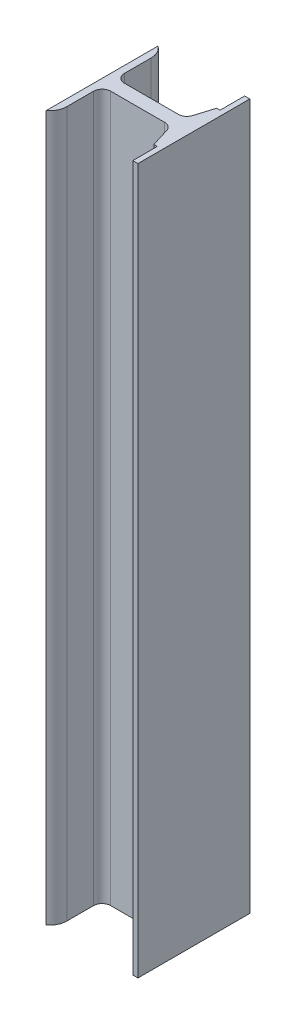
ISO-10303-21;
HEADER;
FILE_DESCRIPTION(('STEP AP214'),'2;1');
FILE_NAME('part.step','',(''),(''),'','','');
FILE_SCHEMA(('AUTOMOTIVE_DESIGN { 1 0 10303 214 1 1 1 1 }'));
ENDSEC;
DATA;
#1=APPLICATION_CONTEXT('core data for automotive mechanical design processes');
#2=APPLICATION_PROTOCOL_DEFINITION('international standard','automotive_design',2000,#1);
#3=PRODUCT_CONTEXT('',#1,'mechanical');
#4=PRODUCT('Part','Part','',(#3));
#5=PRODUCT_RELATED_PRODUCT_CATEGORY('part','',(#4));
#6=PRODUCT_DEFINITION_FORMATION('','',#4);
#7=PRODUCT_DEFINITION_CONTEXT('part definition',#1,'design');
#8=PRODUCT_DEFINITION('design','',#6,#7);
#9=PRODUCT_DEFINITION_SHAPE('','',#8);
#10=(LENGTH_UNIT() NAMED_UNIT(*) SI_UNIT(.MILLI.,.METRE.));
#11=(NAMED_UNIT(*) PLANE_ANGLE_UNIT() SI_UNIT($,.RADIAN.));
#12=(NAMED_UNIT(*) SI_UNIT($,.STERADIAN.) SOLID_ANGLE_UNIT());
#13=UNCERTAINTY_MEASURE_WITH_UNIT(LENGTH_MEASURE(1.E-05),#10,'distance_accuracy_value','');
#14=(GEOMETRIC_REPRESENTATION_CONTEXT(3) GLOBAL_UNCERTAINTY_ASSIGNED_CONTEXT((#13)) GLOBAL_UNIT_ASSIGNED_CONTEXT((#10,
#11,#12)) REPRESENTATION_CONTEXT('',''));
#15=CARTESIAN_POINT('',(0.,0.,0.));
#16=DIRECTION('',(0.,0.,1.));
#17=DIRECTION('',(1.,0.,0.));
#18=AXIS2_PLACEMENT_3D('',#15,#16,#17);
#19=CARTESIAN_POINT('',(-117.923660484395,410.,-93.4117668867217));
#20=DIRECTION('',(1.,0.,0.));
#21=DIRECTION('',(0.,0.,-1.));
#22=AXIS2_PLACEMENT_3D('',#19,#20,#21);
#23=PLANE('',#22);
#24=DIRECTION('',(0.,0.,1.));
#25=VECTOR('',#24,1.);
#26=CARTESIAN_POINT('',(-117.923660484395,0.,-93.4117668867217));
#27=LINE('',#26,#25);
#28=CARTESIAN_POINT('',(-117.923660484395,0.,-93.4117668867217));
#29=VERTEX_POINT('',#28);
#30=CARTESIAN_POINT('',(-117.923660484395,0.,-28.4117668867217));
#31=VERTEX_POINT('',#30);
#32=EDGE_CURVE('E341',#29,#31,#27,.T.);
#33=ORIENTED_EDGE('',*,*,#32,.T.);
#34=DIRECTION('',(0.,-1.,0.));
#35=VECTOR('',#34,1.);
#36=CARTESIAN_POINT('',(-117.923660484395,410.,-28.4117668867217));
#37=LINE('',#36,#35);
#38=CARTESIAN_POINT('',(-117.923660484395,410.,-28.4117668867217));
#39=VERTEX_POINT('',#38);
#40=EDGE_CURVE('E190',#39,#31,#37,.T.);
#41=ORIENTED_EDGE('',*,*,#40,.F.);
#42=DIRECTION('',(0.,0.,1.));
#43=VECTOR('',#42,1.);
#44=CARTESIAN_POINT('',(-117.923660484395,410.,-93.4117668867217));
#45=LINE('',#44,#43);
#46=CARTESIAN_POINT('',(-117.923660484395,410.,-93.4117668867217));
#47=VERTEX_POINT('',#46);
#48=EDGE_CURVE('E174',#47,#39,#45,.T.);
#49=ORIENTED_EDGE('',*,*,#48,.F.);
#50=DIRECTION('',(0.,-1.,0.));
#51=VECTOR('',#50,1.);
#52=CARTESIAN_POINT('',(-117.923660484395,410.,-93.4117668867217));
#53=LINE('',#52,#51);
#54=EDGE_CURVE('E188',#47,#29,#53,.T.);
#55=ORIENTED_EDGE('',*,*,#54,.T.);
#56=EDGE_LOOP('',(#33,#41,#49,#55));
#57=FACE_BOUND('',#56,.T.);
#58=ADVANCED_FACE('F34',(#57),#23,.F.);
#59=CARTESIAN_POINT('',(-113.923660484395,410.,-28.4117668867217));
#60=DIRECTION('',(-1.,0.,0.));
#61=DIRECTION('',(0.,0.,1.));
#62=AXIS2_PLACEMENT_3D('',#59,#60,#61);
#63=PLANE('',#62);
#64=DIRECTION('',(0.,0.,-1.));
#65=VECTOR('',#64,1.);
#66=CARTESIAN_POINT('',(-113.923660484395,0.,-28.4117668867217));
#67=LINE('',#66,#65);
#68=CARTESIAN_POINT('',(-113.923660484395,0.,-36.4117668867217));
#69=VERTEX_POINT('',#68);
#70=CARTESIAN_POINT('',(-113.923660484395,0.,-51.9117668867217));
#71=VERTEX_POINT('',#70);
#72=EDGE_CURVE('E343',#69,#71,#67,.T.);
#73=ORIENTED_EDGE('',*,*,#72,.T.);
#74=DIRECTION('',(0.,-1.,0.));
#75=VECTOR('',#74,1.);
#76=CARTESIAN_POINT('',(-113.923660484395,410.,-51.9117668867217));
#77=LINE('',#76,#75);
#78=CARTESIAN_POINT('',(-113.923660484395,410.,-51.9117668867217));
#79=VERTEX_POINT('',#78);
#80=EDGE_CURVE('E55',#71,#79,#77,.F.);
#81=ORIENTED_EDGE('',*,*,#80,.T.);
#82=DIRECTION('',(0.,0.,-1.));
#83=VECTOR('',#82,1.);
#84=CARTESIAN_POINT('',(-113.923660484395,410.,-28.4117668867217));
#85=LINE('',#84,#83);
#86=CARTESIAN_POINT('',(-113.923660484395,410.,-36.4117668867217));
#87=VERTEX_POINT('',#86);
#88=EDGE_CURVE('E192',#87,#79,#85,.T.);
#89=ORIENTED_EDGE('',*,*,#88,.F.);
#90=DIRECTION('',(0.,-1.,0.));
#91=VECTOR('',#90,1.);
#92=CARTESIAN_POINT('',(-113.923660484395,410.,-36.4117668867217));
#93=LINE('',#92,#91);
#94=EDGE_CURVE('E182',#87,#69,#93,.T.);
#95=ORIENTED_EDGE('',*,*,#94,.T.);
#96=EDGE_LOOP('',(#73,#81,#89,#95));
#97=FACE_BOUND('',#96,.T.);
#98=ADVANCED_FACE('F400',(#97),#63,.F.);
#99=CARTESIAN_POINT('',(-73.9236604843951,410.,-56.9117668867217));
#100=DIRECTION('',(0.,0.,-1.));
#101=DIRECTION('',(-1.,0.,0.));
#102=AXIS2_PLACEMENT_3D('',#99,#100,#101);
#103=PLANE('',#102);
#104=DIRECTION('',(1.,0.,0.));
#105=VECTOR('',#104,1.);
#106=CARTESIAN_POINT('',(-73.9236604843951,0.,-56.9117668867217));
#107=LINE('',#106,#105);
#108=CARTESIAN_POINT('',(-108.923660484395,0.,-56.9117668867217));
#109=VERTEX_POINT('',#108);
#110=CARTESIAN_POINT('',(-77.6298527092741,0.,-56.9117668867217));
#111=VERTEX_POINT('',#110);
#112=EDGE_CURVE('E307',#109,#111,#107,.T.);
#113=ORIENTED_EDGE('',*,*,#112,.T.);
#114=DIRECTION('',(0.,-1.,0.));
#115=VECTOR('',#114,1.);
#116=CARTESIAN_POINT('',(-77.6298527092741,410.,-56.9117668867217));
#117=LINE('',#116,#115);
#118=CARTESIAN_POINT('',(-77.6298527092741,410.,-56.9117668867217));
#119=VERTEX_POINT('',#118);
#120=EDGE_CURVE('E225',#111,#119,#117,.F.);
#121=ORIENTED_EDGE('',*,*,#120,.T.);
#122=DIRECTION('',(1.,0.,0.));
#123=VECTOR('',#122,1.);
#124=CARTESIAN_POINT('',(-73.9236604843951,410.,-56.9117668867217));
#125=LINE('',#124,#123);
#126=CARTESIAN_POINT('',(-108.923660484395,410.,-56.9117668867217));
#127=VERTEX_POINT('',#126);
#128=EDGE_CURVE('E356',#127,#119,#125,.T.);
#129=ORIENTED_EDGE('',*,*,#128,.F.);
#130=DIRECTION('',(0.,-1.,0.));
#131=VECTOR('',#130,1.);
#132=CARTESIAN_POINT('',(-108.923660484395,0.,-56.9117668867217));
#133=LINE('',#132,#131);
#134=EDGE_CURVE('E222',#127,#109,#133,.T.);
#135=ORIENTED_EDGE('',*,*,#134,.T.);
#136=EDGE_LOOP('',(#113,#121,#129,#135));
#137=FACE_BOUND('',#136,.T.);
#138=ADVANCED_FACE('F347',(#137),#103,.F.);
#139=CARTESIAN_POINT('',(-69.5926929103981,410.,-42.6617668867217));
#140=DIRECTION('',(0.956785817481346,0.,-0.29079356847522));
#141=DIRECTION('',(-0.29079356847522,0.,-0.956785817481346));
#142=AXIS2_PLACEMENT_3D('',#139,#140,#141);
#143=PLANE('',#142);
#144=DIRECTION('',(0.29079356847522,0.,0.956785817481346));
#145=VECTOR('',#144,1.);
#146=CARTESIAN_POINT('',(-69.5926929103981,410.,-42.6617668867217));
#147=LINE('',#146,#145);
#148=CARTESIAN_POINT('',(-72.8459236218674,410.,-53.3657347290978));
#149=VERTEX_POINT('',#148);
#150=CARTESIAN_POINT('',(-69.5926929103981,410.,-42.6617668867217));
#151=VERTEX_POINT('',#150);
#152=EDGE_CURVE('E355',#149,#151,#147,.T.);
#153=ORIENTED_EDGE('',*,*,#152,.F.);
#154=DIRECTION('',(0.,-1.,0.));
#155=VECTOR('',#154,1.);
#156=CARTESIAN_POINT('',(-72.8459236218674,1.11022302462516E-13,-53.3657347290978));
#157=LINE('',#156,#155);
#158=CARTESIAN_POINT('',(-72.8459236218674,0.,-53.3657347290978));
#159=VERTEX_POINT('',#158);
#160=EDGE_CURVE('E219',#149,#159,#157,.T.);
#161=ORIENTED_EDGE('',*,*,#160,.T.);
#162=DIRECTION('',(0.29079356847522,0.,0.956785817481346));
#163=VECTOR('',#162,1.);
#164=CARTESIAN_POINT('',(-69.5926929103981,0.,-42.6617668867217));
#165=LINE('',#164,#163);
#166=CARTESIAN_POINT('',(-69.5926929103981,0.,-42.6617668867217));
#167=VERTEX_POINT('',#166);
#168=EDGE_CURVE('E301',#159,#167,#165,.T.);
#169=ORIENTED_EDGE('',*,*,#168,.T.);
#170=DIRECTION('',(0.,-1.,0.));
#171=VECTOR('',#170,1.);
#172=CARTESIAN_POINT('',(-69.5926929103981,410.,-42.6617668867217));
#173=LINE('',#172,#171);
#174=EDGE_CURVE('E202',#151,#167,#173,.T.);
#175=ORIENTED_EDGE('',*,*,#174,.F.);
#176=EDGE_LOOP('',(#153,#161,#169,#175));
#177=FACE_BOUND('',#176,.T.);
#178=ADVANCED_FACE('F357',(#177),#143,.F.);
#179=CARTESIAN_POINT('',(-67.5926929103981,410.,-42.6617668867217));
#180=DIRECTION('',(0.,0.,-1.));
#181=DIRECTION('',(-1.,0.,0.));
#182=AXIS2_PLACEMENT_3D('',#179,#180,#181);
#183=PLANE('',#182);
#184=DIRECTION('',(1.,0.,0.));
#185=VECTOR('',#184,1.);
#186=CARTESIAN_POINT('',(-67.5926929103981,0.,-42.6617668867217));
#187=LINE('',#186,#185);
#188=CARTESIAN_POINT('',(-67.5926929103981,0.,-42.6617668867217));
#189=VERTEX_POINT('',#188);
#190=EDGE_CURVE('E295',#167,#189,#187,.T.);
#191=ORIENTED_EDGE('',*,*,#190,.T.);
#192=DIRECTION('',(0.,-1.,0.));
#193=VECTOR('',#192,1.);
#194=CARTESIAN_POINT('',(-67.5926929103981,410.,-42.6617668867217));
#195=LINE('',#194,#193);
#196=CARTESIAN_POINT('',(-67.5926929103981,410.,-42.6617668867217));
#197=VERTEX_POINT('',#196);
#198=EDGE_CURVE('E286',#197,#189,#195,.T.);
#199=ORIENTED_EDGE('',*,*,#198,.F.);
#200=DIRECTION('',(1.,0.,0.));
#201=VECTOR('',#200,1.);
#202=CARTESIAN_POINT('',(-67.5926929103981,410.,-42.6617668867217));
#203=LINE('',#202,#201);
#204=EDGE_CURVE('E296',#151,#197,#203,.T.);
#205=ORIENTED_EDGE('',*,*,#204,.F.);
#206=ORIENTED_EDGE('',*,*,#174,.T.);
#207=EDGE_LOOP('',(#191,#199,#205,#206));
#208=FACE_BOUND('',#207,.T.);
#209=ADVANCED_FACE('F293',(#208),#183,.F.);
#210=CARTESIAN_POINT('',(-67.5926929103981,410.,-28.4117668867217));
#211=DIRECTION('',(1.,0.,0.));
#212=DIRECTION('',(0.,0.,-1.));
#213=AXIS2_PLACEMENT_3D('',#210,#211,#212);
#214=PLANE('',#213);
#215=DIRECTION('',(0.,0.,1.));
#216=VECTOR('',#215,1.);
#217=CARTESIAN_POINT('',(-67.5926929103981,0.,-28.4117668867217));
#218=LINE('',#217,#216);
#219=CARTESIAN_POINT('',(-67.5926929103981,0.,-28.4117668867217));
#220=VERTEX_POINT('',#219);
#221=EDGE_CURVE('E303',#189,#220,#218,.T.);
#222=ORIENTED_EDGE('',*,*,#221,.T.);
#223=DIRECTION('',(0.,-1.,0.));
#224=VECTOR('',#223,1.);
#225=CARTESIAN_POINT('',(-67.5926929103981,410.,-28.4117668867217));
#226=LINE('',#225,#224);
#227=CARTESIAN_POINT('',(-67.5926929103981,410.,-28.4117668867217));
#228=VERTEX_POINT('',#227);
#229=EDGE_CURVE('E283',#228,#220,#226,.T.);
#230=ORIENTED_EDGE('',*,*,#229,.F.);
#231=DIRECTION('',(0.,0.,1.));
#232=VECTOR('',#231,1.);
#233=CARTESIAN_POINT('',(-67.5926929103981,410.,-28.4117668867217));
#234=LINE('',#233,#232);
#235=EDGE_CURVE('E359',#197,#228,#234,.T.);
#236=ORIENTED_EDGE('',*,*,#235,.F.);
#237=ORIENTED_EDGE('',*,*,#198,.T.);
#238=EDGE_LOOP('',(#222,#230,#236,#237));
#239=FACE_BOUND('',#238,.T.);
#240=ADVANCED_FACE('F390',(#239),#214,.F.);
#241=CARTESIAN_POINT('',(-64.5926929103981,410.,-28.4117668867217));
#242=DIRECTION('',(0.,0.,-1.));
#243=DIRECTION('',(-1.,0.,0.));
#244=AXIS2_PLACEMENT_3D('',#241,#242,#243);
#245=PLANE('',#244);
#246=DIRECTION('',(1.,0.,0.));
#247=VECTOR('',#246,1.);
#248=CARTESIAN_POINT('',(-64.5926929103981,0.,-28.4117668867217));
#249=LINE('',#248,#247);
#250=CARTESIAN_POINT('',(-64.5926929103981,0.,-28.4117668867217));
#251=VERTEX_POINT('',#250);
#252=EDGE_CURVE('E305',#220,#251,#249,.T.);
#253=ORIENTED_EDGE('',*,*,#252,.T.);
#254=DIRECTION('',(0.,-1.,0.));
#255=VECTOR('',#254,1.);
#256=CARTESIAN_POINT('',(-64.5926929103981,410.,-28.4117668867217));
#257=LINE('',#256,#255);
#258=CARTESIAN_POINT('',(-64.5926929103981,410.,-28.4117668867217));
#259=VERTEX_POINT('',#258);
#260=EDGE_CURVE('E280',#259,#251,#257,.T.);
#261=ORIENTED_EDGE('',*,*,#260,.F.);
#262=DIRECTION('',(1.,0.,0.));
#263=VECTOR('',#262,1.);
#264=CARTESIAN_POINT('',(-64.5926929103981,410.,-28.4117668867217));
#265=LINE('',#264,#263);
#266=EDGE_CURVE('E365',#228,#259,#265,.T.);
#267=ORIENTED_EDGE('',*,*,#266,.F.);
#268=ORIENTED_EDGE('',*,*,#229,.T.);
#269=EDGE_LOOP('',(#253,#261,#267,#268));
#270=FACE_BOUND('',#269,.T.);
#271=ADVANCED_FACE('F386',(#270),#245,.F.);
#272=CARTESIAN_POINT('',(-64.5926929103981,410.,-93.4117668867217));
#273=DIRECTION('',(-1.,0.,0.));
#274=DIRECTION('',(0.,0.,1.));
#275=AXIS2_PLACEMENT_3D('',#272,#273,#274);
#276=PLANE('',#275);
#277=DIRECTION('',(0.,0.,-1.));
#278=VECTOR('',#277,1.);
#279=CARTESIAN_POINT('',(-64.5926929103981,0.,-93.4117668867217));
#280=LINE('',#279,#278);
#281=CARTESIAN_POINT('',(-64.5926929103981,0.,-93.4117668867217));
#282=VERTEX_POINT('',#281);
#283=EDGE_CURVE('E312',#251,#282,#280,.T.);
#284=ORIENTED_EDGE('',*,*,#283,.T.);
#285=DIRECTION('',(0.,-1.,0.));
#286=VECTOR('',#285,1.);
#287=CARTESIAN_POINT('',(-64.5926929103981,410.,-93.4117668867217));
#288=LINE('',#287,#286);
#289=CARTESIAN_POINT('',(-64.5926929103981,410.,-93.4117668867217));
#290=VERTEX_POINT('',#289);
#291=EDGE_CURVE('E277',#290,#282,#288,.T.);
#292=ORIENTED_EDGE('',*,*,#291,.F.);
#293=DIRECTION('',(0.,0.,-1.));
#294=VECTOR('',#293,1.);
#295=CARTESIAN_POINT('',(-64.5926929103981,410.,-93.4117668867217));
#296=LINE('',#295,#294);
#297=EDGE_CURVE('E367',#259,#290,#296,.T.);
#298=ORIENTED_EDGE('',*,*,#297,.F.);
#299=ORIENTED_EDGE('',*,*,#260,.T.);
#300=EDGE_LOOP('',(#284,#292,#298,#299));
#301=FACE_BOUND('',#300,.T.);
#302=ADVANCED_FACE('F382',(#301),#276,.F.);
#303=CARTESIAN_POINT('',(-67.5926929103981,410.,-93.4117668867217));
#304=DIRECTION('',(0.,0.,1.));
#305=DIRECTION('',(1.,0.,0.));
#306=AXIS2_PLACEMENT_3D('',#303,#304,#305);
#307=PLANE('',#306);
#308=DIRECTION('',(-1.,0.,0.));
#309=VECTOR('',#308,1.);
#310=CARTESIAN_POINT('',(-67.5926929103981,0.,-93.4117668867217));
#311=LINE('',#310,#309);
#312=CARTESIAN_POINT('',(-67.5926929103981,0.,-93.4117668867217));
#313=VERTEX_POINT('',#312);
#314=EDGE_CURVE('E314',#282,#313,#311,.T.);
#315=ORIENTED_EDGE('',*,*,#314,.T.);
#316=DIRECTION('',(0.,-1.,0.));
#317=VECTOR('',#316,1.);
#318=CARTESIAN_POINT('',(-67.5926929103981,410.,-93.4117668867217));
#319=LINE('',#318,#317);
#320=CARTESIAN_POINT('',(-67.5926929103981,410.,-93.4117668867217));
#321=VERTEX_POINT('',#320);
#322=EDGE_CURVE('E274',#321,#313,#319,.T.);
#323=ORIENTED_EDGE('',*,*,#322,.F.);
#324=DIRECTION('',(-1.,0.,0.));
#325=VECTOR('',#324,1.);
#326=CARTESIAN_POINT('',(-67.5926929103981,410.,-93.4117668867217));
#327=LINE('',#326,#325);
#328=EDGE_CURVE('E369',#290,#321,#327,.T.);
#329=ORIENTED_EDGE('',*,*,#328,.F.);
#330=ORIENTED_EDGE('',*,*,#291,.T.);
#331=EDGE_LOOP('',(#315,#323,#329,#330));
#332=FACE_BOUND('',#331,.T.);
#333=ADVANCED_FACE('F378',(#332),#307,.F.);
#334=CARTESIAN_POINT('',(-67.5926929103981,410.,-93.4117668867217));
#335=DIRECTION('',(1.,0.,0.));
#336=DIRECTION('',(0.,0.,-1.));
#337=AXIS2_PLACEMENT_3D('',#334,#335,#336);
#338=PLANE('',#337);
#339=DIRECTION('',(0.,0.,1.));
#340=VECTOR('',#339,1.);
#341=CARTESIAN_POINT('',(-67.5926929103981,0.,-93.4117668867217));
#342=LINE('',#341,#340);
#343=CARTESIAN_POINT('',(-67.5926929103981,0.,-79.1617668867217));
#344=VERTEX_POINT('',#343);
#345=EDGE_CURVE('E316',#313,#344,#342,.T.);
#346=ORIENTED_EDGE('',*,*,#345,.T.);
#347=DIRECTION('',(0.,-1.,0.));
#348=VECTOR('',#347,1.);
#349=CARTESIAN_POINT('',(-67.5926929103981,410.,-79.1617668867217));
#350=LINE('',#349,#348);
#351=CARTESIAN_POINT('',(-67.5926929103981,410.,-79.1617668867217));
#352=VERTEX_POINT('',#351);
#353=EDGE_CURVE('E271',#352,#344,#350,.T.);
#354=ORIENTED_EDGE('',*,*,#353,.F.);
#355=DIRECTION('',(0.,0.,1.));
#356=VECTOR('',#355,1.);
#357=CARTESIAN_POINT('',(-67.5926929103981,410.,-93.4117668867217));
#358=LINE('',#357,#356);
#359=EDGE_CURVE('E337',#321,#352,#358,.T.);
#360=ORIENTED_EDGE('',*,*,#359,.F.);
#361=ORIENTED_EDGE('',*,*,#322,.T.);
#362=EDGE_LOOP('',(#346,#354,#360,#361));
#363=FACE_BOUND('',#362,.T.);
#364=ADVANCED_FACE('F374',(#363),#338,.F.);
#365=CARTESIAN_POINT('',(-67.5926929103981,410.,-79.1617668867217));
#366=DIRECTION('',(0.,0.,1.));
#367=DIRECTION('',(1.,0.,0.));
#368=AXIS2_PLACEMENT_3D('',#365,#366,#367);
#369=PLANE('',#368);
#370=DIRECTION('',(-1.,0.,0.));
#371=VECTOR('',#370,1.);
#372=CARTESIAN_POINT('',(-67.5926929103981,0.,-79.1617668867217));
#373=LINE('',#372,#371);
#374=CARTESIAN_POINT('',(-69.5926929103981,0.,-79.1617668867217));
#375=VERTEX_POINT('',#374);
#376=EDGE_CURVE('E265',#344,#375,#373,.T.);
#377=ORIENTED_EDGE('',*,*,#376,.T.);
#378=DIRECTION('',(0.,-1.,0.));
#379=VECTOR('',#378,1.);
#380=CARTESIAN_POINT('',(-69.5926929103981,410.,-79.1617668867217));
#381=LINE('',#380,#379);
#382=CARTESIAN_POINT('',(-69.5926929103981,410.,-79.1617668867217));
#383=VERTEX_POINT('',#382);
#384=EDGE_CURVE('E251',#383,#375,#381,.T.);
#385=ORIENTED_EDGE('',*,*,#384,.F.);
#386=DIRECTION('',(-1.,0.,0.));
#387=VECTOR('',#386,1.);
#388=CARTESIAN_POINT('',(-67.5926929103981,410.,-79.1617668867217));
#389=LINE('',#388,#387);
#390=EDGE_CURVE('E334',#352,#383,#389,.T.);
#391=ORIENTED_EDGE('',*,*,#390,.F.);
#392=ORIENTED_EDGE('',*,*,#353,.T.);
#393=EDGE_LOOP('',(#377,#385,#391,#392));
#394=FACE_BOUND('',#393,.T.);
#395=ADVANCED_FACE('F320',(#394),#369,.F.);
#396=CARTESIAN_POINT('',(-69.5926929103981,410.,-79.1617668867217));
#397=DIRECTION('',(0.956785817481346,0.,0.29079356847522));
#398=DIRECTION('',(0.29079356847522,0.,-0.956785817481346));
#399=AXIS2_PLACEMENT_3D('',#396,#397,#398);
#400=PLANE('',#399);
#401=DIRECTION('',(-0.29079356847522,0.,0.956785817481346));
#402=VECTOR('',#401,1.);
#403=CARTESIAN_POINT('',(-69.5926929103981,0.,-79.1617668867217));
#404=LINE('',#403,#402);
#405=CARTESIAN_POINT('',(-72.8459236218674,0.,-68.4577990443456));
#406=VERTEX_POINT('',#405);
#407=EDGE_CURVE('E261',#375,#406,#404,.T.);
#408=ORIENTED_EDGE('',*,*,#407,.T.);
#409=DIRECTION('',(0.,-1.,0.));
#410=VECTOR('',#409,1.);
#411=CARTESIAN_POINT('',(-72.8459236218674,410.,-68.4577990443456));
#412=LINE('',#411,#410);
#413=CARTESIAN_POINT('',(-72.8459236218674,410.,-68.4577990443456));
#414=VERTEX_POINT('',#413);
#415=EDGE_CURVE('E217',#406,#414,#412,.F.);
#416=ORIENTED_EDGE('',*,*,#415,.T.);
#417=DIRECTION('',(-0.29079356847522,0.,0.956785817481346));
#418=VECTOR('',#417,1.);
#419=CARTESIAN_POINT('',(-69.5926929103981,410.,-79.1617668867217));
#420=LINE('',#419,#418);
#421=EDGE_CURVE('E330',#383,#414,#420,.T.);
#422=ORIENTED_EDGE('',*,*,#421,.F.);
#423=ORIENTED_EDGE('',*,*,#384,.T.);
#424=EDGE_LOOP('',(#408,#416,#422,#423));
#425=FACE_BOUND('',#424,.T.);
#426=ADVANCED_FACE('F327',(#425),#400,.F.);
#427=CARTESIAN_POINT('',(-113.923660484395,410.,-64.9117668867217));
#428=DIRECTION('',(0.,0.,1.));
#429=DIRECTION('',(1.,0.,0.));
#430=AXIS2_PLACEMENT_3D('',#427,#428,#429);
#431=PLANE('',#430);
#432=DIRECTION('',(-1.,0.,0.));
#433=VECTOR('',#432,1.);
#434=CARTESIAN_POINT('',(-113.923660484395,410.,-64.9117668867217));
#435=LINE('',#434,#433);
#436=CARTESIAN_POINT('',(-77.6298527092741,410.,-64.9117668867217));
#437=VERTEX_POINT('',#436);
#438=CARTESIAN_POINT('',(-108.923660484395,410.,-64.9117668867217));
#439=VERTEX_POINT('',#438);
#440=EDGE_CURVE('E244',#437,#439,#435,.T.);
#441=ORIENTED_EDGE('',*,*,#440,.F.);
#442=DIRECTION('',(0.,-1.,0.));
#443=VECTOR('',#442,1.);
#444=CARTESIAN_POINT('',(-77.6298527092741,0.,-64.9117668867217));
#445=LINE('',#444,#443);
#446=CARTESIAN_POINT('',(-77.6298527092741,0.,-64.9117668867217));
#447=VERTEX_POINT('',#446);
#448=EDGE_CURVE('E214',#437,#447,#445,.T.);
#449=ORIENTED_EDGE('',*,*,#448,.T.);
#450=DIRECTION('',(-1.,0.,0.));
#451=VECTOR('',#450,1.);
#452=CARTESIAN_POINT('',(-113.923660484395,0.,-64.9117668867217));
#453=LINE('',#452,#451);
#454=CARTESIAN_POINT('',(-108.923660484395,0.,-64.9117668867217));
#455=VERTEX_POINT('',#454);
#456=EDGE_CURVE('E257',#447,#455,#453,.T.);
#457=ORIENTED_EDGE('',*,*,#456,.T.);
#458=DIRECTION('',(0.,-1.,0.));
#459=VECTOR('',#458,1.);
#460=CARTESIAN_POINT('',(-108.923660484395,410.,-64.9117668867217));
#461=LINE('',#460,#459);
#462=EDGE_CURVE('E212',#455,#439,#461,.F.);
#463=ORIENTED_EDGE('',*,*,#462,.T.);
#464=EDGE_LOOP('',(#441,#449,#457,#463));
#465=FACE_BOUND('',#464,.T.);
#466=ADVANCED_FACE('F259',(#465),#431,.F.);
#467=CARTESIAN_POINT('',(-113.923660484395,410.,-93.4117668867217));
#468=DIRECTION('',(-1.,0.,0.));
#469=DIRECTION('',(0.,0.,1.));
#470=AXIS2_PLACEMENT_3D('',#467,#468,#469);
#471=PLANE('',#470);
#472=DIRECTION('',(0.,0.,-1.));
#473=VECTOR('',#472,1.);
#474=CARTESIAN_POINT('',(-113.923660484395,410.,-93.4117668867217));
#475=LINE('',#474,#473);
#476=CARTESIAN_POINT('',(-113.923660484395,410.,-69.9117668867217));
#477=VERTEX_POINT('',#476);
#478=CARTESIAN_POINT('',(-113.923660484395,410.,-85.4117668867217));
#479=VERTEX_POINT('',#478);
#480=EDGE_CURVE('E177',#477,#479,#475,.T.);
#481=ORIENTED_EDGE('',*,*,#480,.F.);
#482=DIRECTION('',(0.,-1.,0.));
#483=VECTOR('',#482,1.);
#484=CARTESIAN_POINT('',(-113.923660484395,0.,-69.9117668867217));
#485=LINE('',#484,#483);
#486=CARTESIAN_POINT('',(-113.923660484395,0.,-69.9117668867217));
#487=VERTEX_POINT('',#486);
#488=EDGE_CURVE('E227',#477,#487,#485,.T.);
#489=ORIENTED_EDGE('',*,*,#488,.T.);
#490=DIRECTION('',(0.,0.,-1.));
#491=VECTOR('',#490,1.);
#492=CARTESIAN_POINT('',(-113.923660484395,0.,-93.4117668867217));
#493=LINE('',#492,#491);
#494=CARTESIAN_POINT('',(-113.923660484395,0.,-85.4117668867217));
#495=VERTEX_POINT('',#494);
#496=EDGE_CURVE('E193',#487,#495,#493,.T.);
#497=ORIENTED_EDGE('',*,*,#496,.T.);
#498=DIRECTION('',(0.,1.,0.));
#499=VECTOR('',#498,1.);
#500=CARTESIAN_POINT('',(-113.923660484395,410.,-85.4117668867217));
#501=LINE('',#500,#499);
#502=EDGE_CURVE('E207',#495,#479,#501,.T.);
#503=ORIENTED_EDGE('',*,*,#502,.T.);
#504=EDGE_LOOP('',(#481,#489,#497,#503));
#505=FACE_BOUND('',#504,.T.);
#506=ADVANCED_FACE('F249',(#505),#471,.F.);
#507=CARTESIAN_POINT('',(0.,410.,0.));
#508=DIRECTION('',(0.,1.,0.));
#509=DIRECTION('',(0.,0.,1.));
#510=AXIS2_PLACEMENT_3D('',#507,#508,#509);
#511=PLANE('',#510);
#512=ORIENTED_EDGE('',*,*,#440,.T.);
#513=CARTESIAN_POINT('',(-108.923660484395,410.,-69.9117668867217));
#514=DIRECTION('',(0.,1.,0.));
#515=DIRECTION('',(0.,0.,1.));
#516=AXIS2_PLACEMENT_3D('',#513,#514,#515);
#517=CIRCLE('',#516,5.);
#518=EDGE_CURVE('E241',#439,#477,#517,.F.);
#519=ORIENTED_EDGE('',*,*,#518,.T.);
#520=ORIENTED_EDGE('',*,*,#480,.T.);
#521=CARTESIAN_POINT('',(-123.923660484395,410.,-85.4117668867217));
#522=DIRECTION('',(0.,1.,0.));
#523=DIRECTION('',(0.,0.,1.));
#524=AXIS2_PLACEMENT_3D('',#521,#522,#523);
#525=CIRCLE('',#524,10.);
#526=EDGE_CURVE('E170',#479,#47,#525,.T.);
#527=ORIENTED_EDGE('',*,*,#526,.T.);
#528=ORIENTED_EDGE('',*,*,#48,.T.);
#529=CARTESIAN_POINT('',(-123.923660484395,410.,-36.4117668867217));
#530=DIRECTION('',(0.,1.,0.));
#531=DIRECTION('',(0.,0.,1.));
#532=AXIS2_PLACEMENT_3D('',#529,#530,#531);
#533=CIRCLE('',#532,10.);
#534=EDGE_CURVE('E183',#39,#87,#533,.T.);
#535=ORIENTED_EDGE('',*,*,#534,.T.);
#536=ORIENTED_EDGE('',*,*,#88,.T.);
#537=CARTESIAN_POINT('',(-108.923660484395,410.,-51.9117668867217));
#538=DIRECTION('',(0.,1.,0.));
#539=DIRECTION('',(0.,0.,1.));
#540=AXIS2_PLACEMENT_3D('',#537,#538,#539);
#541=CIRCLE('',#540,5.);
#542=EDGE_CURVE('E11',#79,#127,#541,.F.);
#543=ORIENTED_EDGE('',*,*,#542,.T.);
#544=ORIENTED_EDGE('',*,*,#128,.T.);
#545=CARTESIAN_POINT('',(-77.6298527092741,410.,-51.9117668867217));
#546=DIRECTION('',(0.,1.,0.));
#547=DIRECTION('',(0.,0.,1.));
#548=AXIS2_PLACEMENT_3D('',#545,#546,#547);
#549=CIRCLE('',#548,5.);
#550=EDGE_CURVE('E237',#119,#149,#549,.F.);
#551=ORIENTED_EDGE('',*,*,#550,.T.);
#552=ORIENTED_EDGE('',*,*,#152,.T.);
#553=ORIENTED_EDGE('',*,*,#204,.T.);
#554=ORIENTED_EDGE('',*,*,#235,.T.);
#555=ORIENTED_EDGE('',*,*,#266,.T.);
#556=ORIENTED_EDGE('',*,*,#297,.T.);
#557=ORIENTED_EDGE('',*,*,#328,.T.);
#558=ORIENTED_EDGE('',*,*,#359,.T.);
#559=ORIENTED_EDGE('',*,*,#390,.T.);
#560=ORIENTED_EDGE('',*,*,#421,.T.);
#561=CARTESIAN_POINT('',(-77.6298527092741,410.,-69.9117668867217));
#562=DIRECTION('',(0.,1.,0.));
#563=DIRECTION('',(0.,0.,1.));
#564=AXIS2_PLACEMENT_3D('',#561,#562,#563);
#565=CIRCLE('',#564,5.);
#566=EDGE_CURVE('E233',#414,#437,#565,.F.);
#567=ORIENTED_EDGE('',*,*,#566,.T.);
#568=EDGE_LOOP('',(#512,#519,#520,#527,#528,#535,#536,#543,#544,#551,#552,#553,#554,#555,#556,
#557,#558,#559,#560,#567));
#569=FACE_BOUND('',#568,.T.);
#570=ADVANCED_FACE('F173',(#569),#511,.T.);
#571=CARTESIAN_POINT('',(0.,0.,0.));
#572=DIRECTION('',(0.,1.,0.));
#573=DIRECTION('',(0.,0.,1.));
#574=AXIS2_PLACEMENT_3D('',#571,#572,#573);
#575=PLANE('',#574);
#576=ORIENTED_EDGE('',*,*,#32,.F.);
#577=CARTESIAN_POINT('',(-123.923660484395,0.,-85.4117668867217));
#578=DIRECTION('',(0.,1.,0.));
#579=DIRECTION('',(0.,0.,1.));
#580=AXIS2_PLACEMENT_3D('',#577,#578,#579);
#581=CIRCLE('',#580,10.);
#582=EDGE_CURVE('E197',#29,#495,#581,.F.);
#583=ORIENTED_EDGE('',*,*,#582,.T.);
#584=ORIENTED_EDGE('',*,*,#496,.F.);
#585=CARTESIAN_POINT('',(-108.923660484395,0.,-69.9117668867217));
#586=DIRECTION('',(0.,1.,0.));
#587=DIRECTION('',(0.,0.,1.));
#588=AXIS2_PLACEMENT_3D('',#585,#586,#587);
#589=CIRCLE('',#588,5.);
#590=EDGE_CURVE('E239',#487,#455,#589,.T.);
#591=ORIENTED_EDGE('',*,*,#590,.T.);
#592=ORIENTED_EDGE('',*,*,#456,.F.);
#593=CARTESIAN_POINT('',(-77.6298527092741,0.,-69.9117668867217));
#594=DIRECTION('',(0.,1.,0.));
#595=DIRECTION('',(0.,0.,1.));
#596=AXIS2_PLACEMENT_3D('',#593,#594,#595);
#597=CIRCLE('',#596,5.);
#598=EDGE_CURVE('E231',#447,#406,#597,.T.);
#599=ORIENTED_EDGE('',*,*,#598,.T.);
#600=ORIENTED_EDGE('',*,*,#407,.F.);
#601=ORIENTED_EDGE('',*,*,#376,.F.);
#602=ORIENTED_EDGE('',*,*,#345,.F.);
#603=ORIENTED_EDGE('',*,*,#314,.F.);
#604=ORIENTED_EDGE('',*,*,#283,.F.);
#605=ORIENTED_EDGE('',*,*,#252,.F.);
#606=ORIENTED_EDGE('',*,*,#221,.F.);
#607=ORIENTED_EDGE('',*,*,#190,.F.);
#608=ORIENTED_EDGE('',*,*,#168,.F.);
#609=CARTESIAN_POINT('',(-77.6298527092741,0.,-51.9117668867217));
#610=DIRECTION('',(0.,1.,0.));
#611=DIRECTION('',(0.,0.,1.));
#612=AXIS2_PLACEMENT_3D('',#609,#610,#611);
#613=CIRCLE('',#612,5.);
#614=EDGE_CURVE('E235',#159,#111,#613,.T.);
#615=ORIENTED_EDGE('',*,*,#614,.T.);
#616=ORIENTED_EDGE('',*,*,#112,.F.);
#617=CARTESIAN_POINT('',(-108.923660484395,0.,-51.9117668867217));
#618=DIRECTION('',(0.,1.,0.));
#619=DIRECTION('',(0.,0.,1.));
#620=AXIS2_PLACEMENT_3D('',#617,#618,#619);
#621=CIRCLE('',#620,5.);
#622=EDGE_CURVE('E42',#109,#71,#621,.T.);
#623=ORIENTED_EDGE('',*,*,#622,.T.);
#624=ORIENTED_EDGE('',*,*,#72,.F.);
#625=CARTESIAN_POINT('',(-123.923660484395,0.,-36.4117668867217));
#626=DIRECTION('',(0.,1.,0.));
#627=DIRECTION('',(0.,0.,1.));
#628=AXIS2_PLACEMENT_3D('',#625,#626,#627);
#629=CIRCLE('',#628,10.);
#630=EDGE_CURVE('E199',#69,#31,#629,.F.);
#631=ORIENTED_EDGE('',*,*,#630,.T.);
#632=EDGE_LOOP('',(#576,#583,#584,#591,#592,#599,#600,#601,#602,#603,#604,#605,#606,#607,#608,
#615,#616,#623,#624,#631));
#633=FACE_BOUND('',#632,.T.);
#634=ADVANCED_FACE('F256',(#633),#575,.F.);
#635=CARTESIAN_POINT('',(-123.923660484395,410.,-85.4117668867217));
#636=DIRECTION('',(0.,1.,0.));
#637=DIRECTION('',(0.,0.,1.));
#638=AXIS2_PLACEMENT_3D('',#635,#636,#637);
#639=CYLINDRICAL_SURFACE('',#638,10.);
#640=ORIENTED_EDGE('',*,*,#526,.F.);
#641=ORIENTED_EDGE('',*,*,#502,.F.);
#642=ORIENTED_EDGE('',*,*,#582,.F.);
#643=ORIENTED_EDGE('',*,*,#54,.F.);
#644=EDGE_LOOP('',(#640,#641,#642,#643));
#645=FACE_BOUND('',#644,.T.);
#646=ADVANCED_FACE('F195',(#645),#639,.T.);
#647=CARTESIAN_POINT('',(-123.923660484395,410.,-36.4117668867217));
#648=DIRECTION('',(0.,-1.,0.));
#649=DIRECTION('',(0.,0.,-1.));
#650=AXIS2_PLACEMENT_3D('',#647,#648,#649);
#651=CYLINDRICAL_SURFACE('',#650,10.);
#652=ORIENTED_EDGE('',*,*,#534,.F.);
#653=ORIENTED_EDGE('',*,*,#40,.T.);
#654=ORIENTED_EDGE('',*,*,#630,.F.);
#655=ORIENTED_EDGE('',*,*,#94,.F.);
#656=EDGE_LOOP('',(#652,#653,#654,#655));
#657=FACE_BOUND('',#656,.T.);
#658=ADVANCED_FACE('F410',(#657),#651,.T.);
#659=CARTESIAN_POINT('',(-77.6298527092741,410.,-69.9117668867217));
#660=DIRECTION('',(0.,1.,0.));
#661=DIRECTION('',(0.,0.,1.));
#662=AXIS2_PLACEMENT_3D('',#659,#660,#661);
#663=CYLINDRICAL_SURFACE('',#662,5.);
#664=ORIENTED_EDGE('',*,*,#566,.F.);
#665=ORIENTED_EDGE('',*,*,#415,.F.);
#666=ORIENTED_EDGE('',*,*,#598,.F.);
#667=ORIENTED_EDGE('',*,*,#448,.F.);
#668=EDGE_LOOP('',(#664,#665,#666,#667));
#669=FACE_BOUND('',#668,.T.);
#670=ADVANCED_FACE('F333',(#669),#663,.F.);
#671=CARTESIAN_POINT('',(-77.6298527092741,410.,-51.9117668867217));
#672=DIRECTION('',(0.,1.,0.));
#673=DIRECTION('',(0.,0.,1.));
#674=AXIS2_PLACEMENT_3D('',#671,#672,#673);
#675=CYLINDRICAL_SURFACE('',#674,5.);
#676=ORIENTED_EDGE('',*,*,#550,.F.);
#677=ORIENTED_EDGE('',*,*,#120,.F.);
#678=ORIENTED_EDGE('',*,*,#614,.F.);
#679=ORIENTED_EDGE('',*,*,#160,.F.);
#680=EDGE_LOOP('',(#676,#677,#678,#679));
#681=FACE_BOUND('',#680,.T.);
#682=ADVANCED_FACE('F353',(#681),#675,.F.);
#683=CARTESIAN_POINT('',(-108.923660484395,410.,-69.9117668867217));
#684=DIRECTION('',(0.,1.,0.));
#685=DIRECTION('',(0.,0.,1.));
#686=AXIS2_PLACEMENT_3D('',#683,#684,#685);
#687=CYLINDRICAL_SURFACE('',#686,5.);
#688=ORIENTED_EDGE('',*,*,#518,.F.);
#689=ORIENTED_EDGE('',*,*,#462,.F.);
#690=ORIENTED_EDGE('',*,*,#590,.F.);
#691=ORIENTED_EDGE('',*,*,#488,.F.);
#692=EDGE_LOOP('',(#688,#689,#690,#691));
#693=FACE_BOUND('',#692,.T.);
#694=ADVANCED_FACE('F253',(#693),#687,.F.);
#695=CARTESIAN_POINT('',(-108.923660484395,410.,-51.9117668867217));
#696=DIRECTION('',(0.,1.,0.));
#697=DIRECTION('',(0.,0.,1.));
#698=AXIS2_PLACEMENT_3D('',#695,#696,#697);
#699=CYLINDRICAL_SURFACE('',#698,5.);
#700=ORIENTED_EDGE('',*,*,#542,.F.);
#701=ORIENTED_EDGE('',*,*,#80,.F.);
#702=ORIENTED_EDGE('',*,*,#622,.F.);
#703=ORIENTED_EDGE('',*,*,#134,.F.);
#704=EDGE_LOOP('',(#700,#701,#702,#703));
#705=FACE_BOUND('',#704,.T.);
#706=ADVANCED_FACE('F36',(#705),#699,.F.);
#707=CLOSED_SHELL('',(#58,#98,#138,#178,#209,#240,#271,#302,#333,#364,#395,#426,#466,#506,#570,
#634,#646,#658,#670,#682,#694,#706));
#708=MANIFOLD_SOLID_BREP('B2',#707);
#709=ADVANCED_BREP_SHAPE_REPRESENTATION('',(#18,#708),#14);
#710=SHAPE_DEFINITION_REPRESENTATION(#9,#709);
ENDSEC;
END-ISO-10303-21;
